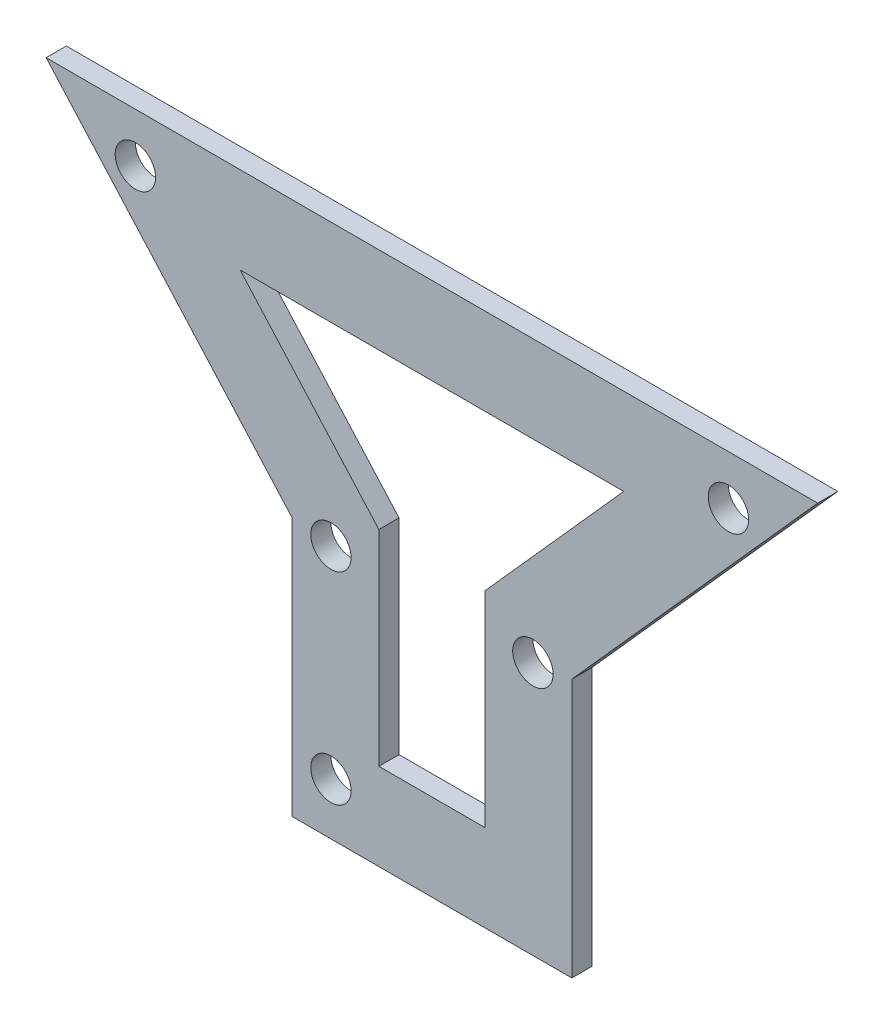
ISO-10303-21;
HEADER;
FILE_DESCRIPTION(('STEP AP214'),'2;1');
FILE_NAME('part.step','',(''),(''),'','','');
FILE_SCHEMA(('AUTOMOTIVE_DESIGN { 1 0 10303 214 1 1 1 1 }'));
ENDSEC;
DATA;
#1=APPLICATION_CONTEXT('core data for automotive mechanical design processes');
#2=APPLICATION_PROTOCOL_DEFINITION('international standard','automotive_design',2000,#1);
#3=PRODUCT_CONTEXT('',#1,'mechanical');
#4=PRODUCT('Part','Part','',(#3));
#5=PRODUCT_RELATED_PRODUCT_CATEGORY('part','',(#4));
#6=PRODUCT_DEFINITION_FORMATION('','',#4);
#7=PRODUCT_DEFINITION_CONTEXT('part definition',#1,'design');
#8=PRODUCT_DEFINITION('design','',#6,#7);
#9=PRODUCT_DEFINITION_SHAPE('','',#8);
#10=(LENGTH_UNIT() NAMED_UNIT(*) SI_UNIT(.MILLI.,.METRE.));
#11=(NAMED_UNIT(*) PLANE_ANGLE_UNIT() SI_UNIT($,.RADIAN.));
#12=(NAMED_UNIT(*) SI_UNIT($,.STERADIAN.) SOLID_ANGLE_UNIT());
#13=UNCERTAINTY_MEASURE_WITH_UNIT(LENGTH_MEASURE(1.E-05),#10,'distance_accuracy_value','');
#14=(GEOMETRIC_REPRESENTATION_CONTEXT(3) GLOBAL_UNCERTAINTY_ASSIGNED_CONTEXT((#13)) GLOBAL_UNIT_ASSIGNED_CONTEXT((#10,
#11,#12)) REPRESENTATION_CONTEXT('',''));
#15=CARTESIAN_POINT('',(0.,0.,0.));
#16=DIRECTION('',(0.,0.,1.));
#17=DIRECTION('',(1.,0.,0.));
#18=AXIS2_PLACEMENT_3D('',#15,#16,#17);
#19=CARTESIAN_POINT('',(0.,0.,10.));
#20=DIRECTION('',(0.,0.,-1.));
#21=DIRECTION('',(-1.,0.,0.));
#22=AXIS2_PLACEMENT_3D('',#19,#20,#21);
#23=PLANE('',#22);
#24=CARTESIAN_POINT('',(-146.807623038619,114.578724559198,10.));
#25=DIRECTION('',(0.,0.,1.));
#26=DIRECTION('',(1.,0.,0.));
#27=AXIS2_PLACEMENT_3D('',#24,#25,#26);
#28=CIRCLE('',#27,9.99999999999998);
#29=CARTESIAN_POINT('',(-136.807623038619,114.578724559198,10.));
#30=VERTEX_POINT('',#29);
#31=EDGE_CURVE('E501',#30,#30,#28,.T.);
#32=ORIENTED_EDGE('',*,*,#31,.F.);
#33=EDGE_LOOP('',(#32));
#34=FACE_BOUND('',#33,.T.);
#35=CARTESIAN_POINT('',(50.,0.,10.));
#36=DIRECTION('',(0.,0.,1.));
#37=DIRECTION('',(1.,0.,0.));
#38=AXIS2_PLACEMENT_3D('',#35,#36,#37);
#39=CIRCLE('',#38,9.99999999999999);
#40=CARTESIAN_POINT('',(60.,0.,10.));
#41=VERTEX_POINT('',#40);
#42=EDGE_CURVE('E525',#41,#41,#39,.T.);
#43=ORIENTED_EDGE('',*,*,#42,.F.);
#44=EDGE_LOOP('',(#43));
#45=FACE_BOUND('',#44,.T.);
#46=CARTESIAN_POINT('',(-50.,-100.,10.));
#47=DIRECTION('',(0.,0.,1.));
#48=DIRECTION('',(1.,0.,0.));
#49=AXIS2_PLACEMENT_3D('',#46,#47,#48);
#50=CIRCLE('',#49,10.);
#51=CARTESIAN_POINT('',(-40.,-100.,10.));
#52=VERTEX_POINT('',#51);
#53=EDGE_CURVE('E517',#52,#52,#50,.T.);
#54=ORIENTED_EDGE('',*,*,#53,.F.);
#55=EDGE_LOOP('',(#54));
#56=FACE_BOUND('',#55,.T.);
#57=CARTESIAN_POINT('',(-50.,0.,10.));
#58=DIRECTION('',(0.,0.,1.));
#59=DIRECTION('',(1.,0.,0.));
#60=AXIS2_PLACEMENT_3D('',#57,#58,#59);
#61=CIRCLE('',#60,10.);
#62=CARTESIAN_POINT('',(-40.,0.,10.));
#63=VERTEX_POINT('',#62);
#64=EDGE_CURVE('E516',#63,#63,#61,.T.);
#65=ORIENTED_EDGE('',*,*,#64,.F.);
#66=EDGE_LOOP('',(#65));
#67=FACE_BOUND('',#66,.T.);
#68=CARTESIAN_POINT('',(146.807623038619,114.578724559198,10.));
#69=DIRECTION('',(0.,0.,1.));
#70=DIRECTION('',(1.,0.,0.));
#71=AXIS2_PLACEMENT_3D('',#68,#69,#70);
#72=CIRCLE('',#71,10.);
#73=CARTESIAN_POINT('',(156.807623038619,114.578724559198,10.));
#74=VERTEX_POINT('',#73);
#75=EDGE_CURVE('E509',#74,#74,#72,.T.);
#76=ORIENTED_EDGE('',*,*,#75,.F.);
#77=EDGE_LOOP('',(#76));
#78=FACE_BOUND('',#77,.T.);
#79=DIRECTION('',(0.,-1.,0.));
#80=VECTOR('',#79,1.);
#81=CARTESIAN_POINT('',(69.2702640138782,2.53280531523941,10.));
#82=LINE('',#81,#80);
#83=CARTESIAN_POINT('',(69.2702640138782,2.53280531523941,10.));
#84=VERTEX_POINT('',#83);
#85=CARTESIAN_POINT('',(69.2702640138782,-125.601784109811,10.));
#86=VERTEX_POINT('',#85);
#87=EDGE_CURVE('E237',#84,#86,#82,.T.);
#88=ORIENTED_EDGE('',*,*,#87,.F.);
#89=DIRECTION('',(0.665963027274692,0.745984749377042,0.));
#90=VECTOR('',#89,1.);
#91=CARTESIAN_POINT('',(69.2702640138782,2.53280531523941,10.));
#92=LINE('',#91,#90);
#93=CARTESIAN_POINT('',(190.995381487231,138.884340659251,10.));
#94=VERTEX_POINT('',#93);
#95=EDGE_CURVE('E256',#84,#94,#92,.T.);
#96=ORIENTED_EDGE('',*,*,#95,.T.);
#97=DIRECTION('',(-1.,0.,0.));
#98=VECTOR('',#97,1.);
#99=CARTESIAN_POINT('',(190.995381487231,138.884340659251,10.));
#100=LINE('',#99,#98);
#101=CARTESIAN_POINT('',(-190.995381487231,138.884340659251,10.));
#102=VERTEX_POINT('',#101);
#103=EDGE_CURVE('E253',#94,#102,#100,.T.);
#104=ORIENTED_EDGE('',*,*,#103,.T.);
#105=DIRECTION('',(-0.665963027274693,0.745984749377041,0.));
#106=VECTOR('',#105,1.);
#107=CARTESIAN_POINT('',(-69.2702640138782,2.5328053152393,10.));
#108=LINE('',#107,#106);
#109=CARTESIAN_POINT('',(-69.2702640138782,2.5328053152393,10.));
#110=VERTEX_POINT('',#109);
#111=EDGE_CURVE('E249',#110,#102,#108,.T.);
#112=ORIENTED_EDGE('',*,*,#111,.F.);
#113=DIRECTION('',(0.,-1.,0.));
#114=VECTOR('',#113,1.);
#115=CARTESIAN_POINT('',(-69.2702640138782,2.5328053152393,10.));
#116=LINE('',#115,#114);
#117=CARTESIAN_POINT('',(-69.2702640138782,-125.601784109811,10.));
#118=VERTEX_POINT('',#117);
#119=EDGE_CURVE('E246',#110,#118,#116,.T.);
#120=ORIENTED_EDGE('',*,*,#119,.T.);
#121=DIRECTION('',(-1.,0.,0.));
#122=VECTOR('',#121,1.);
#123=CARTESIAN_POINT('',(69.2702640138782,-125.601784109811,10.));
#124=LINE('',#123,#122);
#125=EDGE_CURVE('E241',#86,#118,#124,.T.);
#126=ORIENTED_EDGE('',*,*,#125,.F.);
#127=EDGE_LOOP('',(#88,#96,#104,#112,#120,#126));
#128=FACE_BOUND('',#127,.T.);
#129=DIRECTION('',(0.665963027274692,0.745984749377041,0.));
#130=VECTOR('',#129,1.);
#131=CARTESIAN_POINT('',(26.2702640138782,18.9340998758185,10.));
#132=LINE('',#131,#130);
#133=CARTESIAN_POINT('',(26.2702640138782,18.9340998758185,10.));
#134=VERTEX_POINT('',#133);
#135=CARTESIAN_POINT('',(94.9660588601479,95.8843406592509,10.));
#136=VERTEX_POINT('',#135);
#137=EDGE_CURVE('E165',#134,#136,#132,.T.);
#138=ORIENTED_EDGE('',*,*,#137,.F.);
#139=DIRECTION('',(0.,1.,0.));
#140=VECTOR('',#139,1.);
#141=CARTESIAN_POINT('',(26.2702640138782,-82.6017841098114,10.));
#142=LINE('',#141,#140);
#143=CARTESIAN_POINT('',(26.2702640138782,-82.6017841098114,10.));
#144=VERTEX_POINT('',#143);
#145=EDGE_CURVE('E202',#144,#134,#142,.T.);
#146=ORIENTED_EDGE('',*,*,#145,.F.);
#147=DIRECTION('',(1.,0.,0.));
#148=VECTOR('',#147,1.);
#149=CARTESIAN_POINT('',(-26.2702640138782,-82.6017841098114,10.));
#150=LINE('',#149,#148);
#151=CARTESIAN_POINT('',(-26.2702640138782,-82.6017841098114,10.));
#152=VERTEX_POINT('',#151);
#153=EDGE_CURVE('E199',#152,#144,#150,.T.);
#154=ORIENTED_EDGE('',*,*,#153,.F.);
#155=DIRECTION('',(0.,1.,0.));
#156=VECTOR('',#155,1.);
#157=CARTESIAN_POINT('',(-26.2702640138782,-82.6017841098114,10.));
#158=LINE('',#157,#156);
#159=CARTESIAN_POINT('',(-26.2702640138782,18.9340998758184,10.));
#160=VERTEX_POINT('',#159);
#161=EDGE_CURVE('E193',#152,#160,#158,.T.);
#162=ORIENTED_EDGE('',*,*,#161,.T.);
#163=DIRECTION('',(-0.665963027274692,0.745984749377041,0.));
#164=VECTOR('',#163,1.);
#165=CARTESIAN_POINT('',(-26.2702640138782,18.9340998758184,10.));
#166=LINE('',#165,#164);
#167=CARTESIAN_POINT('',(-94.9660588601479,95.8843406592508,10.));
#168=VERTEX_POINT('',#167);
#169=EDGE_CURVE('E189',#160,#168,#166,.T.);
#170=ORIENTED_EDGE('',*,*,#169,.T.);
#171=DIRECTION('',(-1.,0.,0.));
#172=VECTOR('',#171,1.);
#173=CARTESIAN_POINT('',(94.9660588601479,95.8843406592509,10.));
#174=LINE('',#173,#172);
#175=EDGE_CURVE('E174',#136,#168,#174,.T.);
#176=ORIENTED_EDGE('',*,*,#175,.F.);
#177=EDGE_LOOP('',(#138,#146,#154,#162,#170,#176));
#178=FACE_BOUND('',#177,.T.);
#179=ADVANCED_FACE('F74',(#34,#45,#56,#67,#78,#128,#178),#23,.F.);
#180=CARTESIAN_POINT('',(0.,0.,0.));
#181=DIRECTION('',(0.,0.,-1.));
#182=DIRECTION('',(-1.,0.,0.));
#183=AXIS2_PLACEMENT_3D('',#180,#181,#182);
#184=PLANE('',#183);
#185=CARTESIAN_POINT('',(-146.807623038619,114.578724559198,0.));
#186=DIRECTION('',(0.,0.,1.));
#187=DIRECTION('',(1.,0.,0.));
#188=AXIS2_PLACEMENT_3D('',#185,#186,#187);
#189=CIRCLE('',#188,9.99999999999998);
#190=CARTESIAN_POINT('',(-136.807623038619,114.578724559198,0.));
#191=VERTEX_POINT('',#190);
#192=EDGE_CURVE('E207',#191,#191,#189,.T.);
#193=ORIENTED_EDGE('',*,*,#192,.T.);
#194=EDGE_LOOP('',(#193));
#195=FACE_BOUND('',#194,.T.);
#196=CARTESIAN_POINT('',(50.,0.,0.));
#197=DIRECTION('',(0.,0.,1.));
#198=DIRECTION('',(1.,0.,0.));
#199=AXIS2_PLACEMENT_3D('',#196,#197,#198);
#200=CIRCLE('',#199,9.99999999999999);
#201=CARTESIAN_POINT('',(60.,0.,0.));
#202=VERTEX_POINT('',#201);
#203=EDGE_CURVE('E521',#202,#202,#200,.T.);
#204=ORIENTED_EDGE('',*,*,#203,.T.);
#205=EDGE_LOOP('',(#204));
#206=FACE_BOUND('',#205,.T.);
#207=CARTESIAN_POINT('',(-50.,-100.,0.));
#208=DIRECTION('',(0.,0.,1.));
#209=DIRECTION('',(1.,0.,0.));
#210=AXIS2_PLACEMENT_3D('',#207,#208,#209);
#211=CIRCLE('',#210,10.);
#212=CARTESIAN_POINT('',(-40.,-100.,0.));
#213=VERTEX_POINT('',#212);
#214=EDGE_CURVE('E512',#213,#213,#211,.T.);
#215=ORIENTED_EDGE('',*,*,#214,.T.);
#216=EDGE_LOOP('',(#215));
#217=FACE_BOUND('',#216,.T.);
#218=CARTESIAN_POINT('',(-50.,0.,0.));
#219=DIRECTION('',(0.,0.,1.));
#220=DIRECTION('',(1.,0.,0.));
#221=AXIS2_PLACEMENT_3D('',#218,#219,#220);
#222=CIRCLE('',#221,10.);
#223=CARTESIAN_POINT('',(-40.,0.,0.));
#224=VERTEX_POINT('',#223);
#225=EDGE_CURVE('E532',#224,#224,#222,.T.);
#226=ORIENTED_EDGE('',*,*,#225,.T.);
#227=EDGE_LOOP('',(#226));
#228=FACE_BOUND('',#227,.T.);
#229=CARTESIAN_POINT('',(146.807623038619,114.578724559198,0.));
#230=DIRECTION('',(0.,0.,1.));
#231=DIRECTION('',(1.,0.,0.));
#232=AXIS2_PLACEMENT_3D('',#229,#230,#231);
#233=CIRCLE('',#232,10.);
#234=CARTESIAN_POINT('',(156.807623038619,114.578724559198,0.));
#235=VERTEX_POINT('',#234);
#236=EDGE_CURVE('E503',#235,#235,#233,.T.);
#237=ORIENTED_EDGE('',*,*,#236,.T.);
#238=EDGE_LOOP('',(#237));
#239=FACE_BOUND('',#238,.T.);
#240=DIRECTION('',(0.,-1.,0.));
#241=VECTOR('',#240,1.);
#242=CARTESIAN_POINT('',(69.2702640138782,2.53280531523941,0.));
#243=LINE('',#242,#241);
#244=CARTESIAN_POINT('',(69.2702640138782,2.53280531523941,0.));
#245=VERTEX_POINT('',#244);
#246=CARTESIAN_POINT('',(69.2702640138782,-125.601784109811,0.));
#247=VERTEX_POINT('',#246);
#248=EDGE_CURVE('E183',#245,#247,#243,.T.);
#249=ORIENTED_EDGE('',*,*,#248,.T.);
#250=DIRECTION('',(-1.,0.,0.));
#251=VECTOR('',#250,1.);
#252=CARTESIAN_POINT('',(69.2702640138782,-125.601784109811,0.));
#253=LINE('',#252,#251);
#254=CARTESIAN_POINT('',(-69.2702640138782,-125.601784109811,0.));
#255=VERTEX_POINT('',#254);
#256=EDGE_CURVE('E262',#247,#255,#253,.T.);
#257=ORIENTED_EDGE('',*,*,#256,.T.);
#258=DIRECTION('',(0.,-1.,0.));
#259=VECTOR('',#258,1.);
#260=CARTESIAN_POINT('',(-69.2702640138782,2.5328053152393,0.));
#261=LINE('',#260,#259);
#262=CARTESIAN_POINT('',(-69.2702640138782,2.5328053152393,0.));
#263=VERTEX_POINT('',#262);
#264=EDGE_CURVE('E266',#263,#255,#261,.T.);
#265=ORIENTED_EDGE('',*,*,#264,.F.);
#266=DIRECTION('',(-0.665963027274693,0.745984749377041,0.));
#267=VECTOR('',#266,1.);
#268=CARTESIAN_POINT('',(-69.2702640138782,2.5328053152393,0.));
#269=LINE('',#268,#267);
#270=CARTESIAN_POINT('',(-190.995381487231,138.884340659251,0.));
#271=VERTEX_POINT('',#270);
#272=EDGE_CURVE('E270',#263,#271,#269,.T.);
#273=ORIENTED_EDGE('',*,*,#272,.T.);
#274=DIRECTION('',(-1.,0.,0.));
#275=VECTOR('',#274,1.);
#276=CARTESIAN_POINT('',(190.995381487231,138.884340659251,0.));
#277=LINE('',#276,#275);
#278=CARTESIAN_POINT('',(190.995381487231,138.884340659251,0.));
#279=VERTEX_POINT('',#278);
#280=EDGE_CURVE('E274',#279,#271,#277,.T.);
#281=ORIENTED_EDGE('',*,*,#280,.F.);
#282=DIRECTION('',(0.665963027274692,0.745984749377042,0.));
#283=VECTOR('',#282,1.);
#284=CARTESIAN_POINT('',(69.2702640138782,2.53280531523941,0.));
#285=LINE('',#284,#283);
#286=EDGE_CURVE('E242',#245,#279,#285,.T.);
#287=ORIENTED_EDGE('',*,*,#286,.F.);
#288=EDGE_LOOP('',(#249,#257,#265,#273,#281,#287));
#289=FACE_BOUND('',#288,.T.);
#290=DIRECTION('',(0.,1.,0.));
#291=VECTOR('',#290,1.);
#292=CARTESIAN_POINT('',(26.2702640138782,-82.6017841098114,0.));
#293=LINE('',#292,#291);
#294=CARTESIAN_POINT('',(26.2702640138782,-82.6017841098114,0.));
#295=VERTEX_POINT('',#294);
#296=CARTESIAN_POINT('',(26.2702640138782,18.9340998758185,0.));
#297=VERTEX_POINT('',#296);
#298=EDGE_CURVE('E175',#295,#297,#293,.T.);
#299=ORIENTED_EDGE('',*,*,#298,.T.);
#300=DIRECTION('',(0.665963027274692,0.745984749377041,0.));
#301=VECTOR('',#300,1.);
#302=CARTESIAN_POINT('',(26.2702640138782,18.9340998758185,0.));
#303=LINE('',#302,#301);
#304=CARTESIAN_POINT('',(94.9660588601479,95.8843406592509,0.));
#305=VERTEX_POINT('',#304);
#306=EDGE_CURVE('E100',#297,#305,#303,.T.);
#307=ORIENTED_EDGE('',*,*,#306,.T.);
#308=DIRECTION('',(-1.,0.,0.));
#309=VECTOR('',#308,1.);
#310=CARTESIAN_POINT('',(94.9660588601479,95.8843406592509,0.));
#311=LINE('',#310,#309);
#312=CARTESIAN_POINT('',(-94.9660588601479,95.8843406592508,0.));
#313=VERTEX_POINT('',#312);
#314=EDGE_CURVE('E181',#305,#313,#311,.T.);
#315=ORIENTED_EDGE('',*,*,#314,.T.);
#316=DIRECTION('',(-0.665963027274692,0.745984749377041,0.));
#317=VECTOR('',#316,1.);
#318=CARTESIAN_POINT('',(-26.2702640138782,18.9340998758184,0.));
#319=LINE('',#318,#317);
#320=CARTESIAN_POINT('',(-26.2702640138782,18.9340998758184,0.));
#321=VERTEX_POINT('',#320);
#322=EDGE_CURVE('E210',#321,#313,#319,.T.);
#323=ORIENTED_EDGE('',*,*,#322,.F.);
#324=DIRECTION('',(0.,1.,0.));
#325=VECTOR('',#324,1.);
#326=CARTESIAN_POINT('',(-26.2702640138782,-82.6017841098114,0.));
#327=LINE('',#326,#325);
#328=CARTESIAN_POINT('',(-26.2702640138782,-82.6017841098114,0.));
#329=VERTEX_POINT('',#328);
#330=EDGE_CURVE('E214',#329,#321,#327,.T.);
#331=ORIENTED_EDGE('',*,*,#330,.F.);
#332=DIRECTION('',(1.,0.,0.));
#333=VECTOR('',#332,1.);
#334=CARTESIAN_POINT('',(-26.2702640138782,-82.6017841098114,0.));
#335=LINE('',#334,#333);
#336=EDGE_CURVE('E218',#329,#295,#335,.T.);
#337=ORIENTED_EDGE('',*,*,#336,.T.);
#338=EDGE_LOOP('',(#299,#307,#315,#323,#331,#337));
#339=FACE_BOUND('',#338,.T.);
#340=ADVANCED_FACE('F302',(#195,#206,#217,#228,#239,#289,#339),#184,.T.);
#341=CARTESIAN_POINT('',(69.2702640138782,2.53280531523941,10.));
#342=DIRECTION('',(1.,0.,0.));
#343=DIRECTION('',(0.,1.,0.));
#344=AXIS2_PLACEMENT_3D('',#341,#342,#343);
#345=PLANE('',#344);
#346=ORIENTED_EDGE('',*,*,#248,.F.);
#347=DIRECTION('',(0.,0.,-1.));
#348=VECTOR('',#347,1.);
#349=CARTESIAN_POINT('',(69.2702640138782,2.53280531523941,10.));
#350=LINE('',#349,#348);
#351=EDGE_CURVE('E12',#84,#245,#350,.T.);
#352=ORIENTED_EDGE('',*,*,#351,.F.);
#353=ORIENTED_EDGE('',*,*,#87,.T.);
#354=DIRECTION('',(0.,0.,-1.));
#355=VECTOR('',#354,1.);
#356=CARTESIAN_POINT('',(69.2702640138782,-125.601784109811,10.));
#357=LINE('',#356,#355);
#358=EDGE_CURVE('E78',#86,#247,#357,.T.);
#359=ORIENTED_EDGE('',*,*,#358,.T.);
#360=EDGE_LOOP('',(#346,#352,#353,#359));
#361=FACE_BOUND('',#360,.T.);
#362=ADVANCED_FACE('F76',(#361),#345,.T.);
#363=CARTESIAN_POINT('',(69.2702640138782,2.53280531523941,10.));
#364=DIRECTION('',(-0.745984749377042,0.665963027274692,0.));
#365=DIRECTION('',(-0.665963027274692,-0.745984749377042,0.));
#366=AXIS2_PLACEMENT_3D('',#363,#364,#365);
#367=PLANE('',#366);
#368=ORIENTED_EDGE('',*,*,#286,.T.);
#369=DIRECTION('',(0.,0.,-1.));
#370=VECTOR('',#369,1.);
#371=CARTESIAN_POINT('',(190.995381487231,138.884340659251,10.));
#372=LINE('',#371,#370);
#373=EDGE_CURVE('E84',#94,#279,#372,.T.);
#374=ORIENTED_EDGE('',*,*,#373,.F.);
#375=ORIENTED_EDGE('',*,*,#95,.F.);
#376=ORIENTED_EDGE('',*,*,#351,.T.);
#377=EDGE_LOOP('',(#368,#374,#375,#376));
#378=FACE_BOUND('',#377,.T.);
#379=ADVANCED_FACE('F307',(#378),#367,.F.);
#380=CARTESIAN_POINT('',(190.995381487231,138.884340659251,10.));
#381=DIRECTION('',(0.,-1.,0.));
#382=DIRECTION('',(1.,0.,0.));
#383=AXIS2_PLACEMENT_3D('',#380,#381,#382);
#384=PLANE('',#383);
#385=ORIENTED_EDGE('',*,*,#280,.T.);
#386=DIRECTION('',(0.,0.,-1.));
#387=VECTOR('',#386,1.);
#388=CARTESIAN_POINT('',(-190.995381487231,138.884340659251,10.));
#389=LINE('',#388,#387);
#390=EDGE_CURVE('E283',#102,#271,#389,.T.);
#391=ORIENTED_EDGE('',*,*,#390,.F.);
#392=ORIENTED_EDGE('',*,*,#103,.F.);
#393=ORIENTED_EDGE('',*,*,#373,.T.);
#394=EDGE_LOOP('',(#385,#391,#392,#393));
#395=FACE_BOUND('',#394,.T.);
#396=ADVANCED_FACE('F311',(#395),#384,.F.);
#397=CARTESIAN_POINT('',(-69.2702640138782,2.5328053152393,10.));
#398=DIRECTION('',(-0.745984749377041,-0.665963027274693,0.));
#399=DIRECTION('',(0.665963027274693,-0.745984749377041,0.));
#400=AXIS2_PLACEMENT_3D('',#397,#398,#399);
#401=PLANE('',#400);
#402=ORIENTED_EDGE('',*,*,#272,.F.);
#403=DIRECTION('',(0.,0.,-1.));
#404=VECTOR('',#403,1.);
#405=CARTESIAN_POINT('',(-69.2702640138782,2.5328053152393,10.));
#406=LINE('',#405,#404);
#407=EDGE_CURVE('E286',#110,#263,#406,.T.);
#408=ORIENTED_EDGE('',*,*,#407,.F.);
#409=ORIENTED_EDGE('',*,*,#111,.T.);
#410=ORIENTED_EDGE('',*,*,#390,.T.);
#411=EDGE_LOOP('',(#402,#408,#409,#410));
#412=FACE_BOUND('',#411,.T.);
#413=ADVANCED_FACE('F320',(#412),#401,.T.);
#414=CARTESIAN_POINT('',(-69.2702640138782,2.5328053152393,10.));
#415=DIRECTION('',(1.,0.,0.));
#416=DIRECTION('',(0.,1.,0.));
#417=AXIS2_PLACEMENT_3D('',#414,#415,#416);
#418=PLANE('',#417);
#419=ORIENTED_EDGE('',*,*,#264,.T.);
#420=DIRECTION('',(0.,0.,-1.));
#421=VECTOR('',#420,1.);
#422=CARTESIAN_POINT('',(-69.2702640138782,-125.601784109811,10.));
#423=LINE('',#422,#421);
#424=EDGE_CURVE('E288',#118,#255,#423,.T.);
#425=ORIENTED_EDGE('',*,*,#424,.F.);
#426=ORIENTED_EDGE('',*,*,#119,.F.);
#427=ORIENTED_EDGE('',*,*,#407,.T.);
#428=EDGE_LOOP('',(#419,#425,#426,#427));
#429=FACE_BOUND('',#428,.T.);
#430=ADVANCED_FACE('F317',(#429),#418,.F.);
#431=CARTESIAN_POINT('',(69.2702640138782,-125.601784109811,10.));
#432=DIRECTION('',(0.,-1.,0.));
#433=DIRECTION('',(0.,0.,-1.));
#434=AXIS2_PLACEMENT_3D('',#431,#432,#433);
#435=PLANE('',#434);
#436=ORIENTED_EDGE('',*,*,#256,.F.);
#437=ORIENTED_EDGE('',*,*,#358,.F.);
#438=ORIENTED_EDGE('',*,*,#125,.T.);
#439=ORIENTED_EDGE('',*,*,#424,.T.);
#440=EDGE_LOOP('',(#436,#437,#438,#439));
#441=FACE_BOUND('',#440,.T.);
#442=ADVANCED_FACE('F298',(#441),#435,.T.);
#443=CARTESIAN_POINT('',(26.2702640138782,18.9340998758185,10.));
#444=DIRECTION('',(-0.745984749377041,0.665963027274692,0.));
#445=DIRECTION('',(-0.665963027274692,-0.745984749377042,0.));
#446=AXIS2_PLACEMENT_3D('',#443,#444,#445);
#447=PLANE('',#446);
#448=ORIENTED_EDGE('',*,*,#306,.F.);
#449=DIRECTION('',(0.,0.,-1.));
#450=VECTOR('',#449,1.);
#451=CARTESIAN_POINT('',(26.2702640138782,18.9340998758185,10.));
#452=LINE('',#451,#450);
#453=EDGE_CURVE('E169',#134,#297,#452,.T.);
#454=ORIENTED_EDGE('',*,*,#453,.F.);
#455=ORIENTED_EDGE('',*,*,#137,.T.);
#456=DIRECTION('',(0.,0.,-1.));
#457=VECTOR('',#456,1.);
#458=CARTESIAN_POINT('',(94.9660588601479,95.8843406592509,10.));
#459=LINE('',#458,#457);
#460=EDGE_CURVE('E168',#136,#305,#459,.T.);
#461=ORIENTED_EDGE('',*,*,#460,.T.);
#462=EDGE_LOOP('',(#448,#454,#455,#461));
#463=FACE_BOUND('',#462,.T.);
#464=ADVANCED_FACE('F167',(#463),#447,.T.);
#465=CARTESIAN_POINT('',(94.9660588601479,95.8843406592509,10.));
#466=DIRECTION('',(0.,-1.,0.));
#467=DIRECTION('',(1.,0.,0.));
#468=AXIS2_PLACEMENT_3D('',#465,#466,#467);
#469=PLANE('',#468);
#470=ORIENTED_EDGE('',*,*,#314,.F.);
#471=ORIENTED_EDGE('',*,*,#460,.F.);
#472=ORIENTED_EDGE('',*,*,#175,.T.);
#473=DIRECTION('',(0.,0.,-1.));
#474=VECTOR('',#473,1.);
#475=CARTESIAN_POINT('',(-94.9660588601479,95.8843406592508,10.));
#476=LINE('',#475,#474);
#477=EDGE_CURVE('E184',#168,#313,#476,.T.);
#478=ORIENTED_EDGE('',*,*,#477,.T.);
#479=EDGE_LOOP('',(#470,#471,#472,#478));
#480=FACE_BOUND('',#479,.T.);
#481=ADVANCED_FACE('F178',(#480),#469,.T.);
#482=CARTESIAN_POINT('',(-26.2702640138782,18.9340998758184,10.));
#483=DIRECTION('',(-0.745984749377041,-0.665963027274692,0.));
#484=DIRECTION('',(0.665963027274692,-0.745984749377042,0.));
#485=AXIS2_PLACEMENT_3D('',#482,#483,#484);
#486=PLANE('',#485);
#487=ORIENTED_EDGE('',*,*,#322,.T.);
#488=ORIENTED_EDGE('',*,*,#477,.F.);
#489=ORIENTED_EDGE('',*,*,#169,.F.);
#490=DIRECTION('',(0.,0.,-1.));
#491=VECTOR('',#490,1.);
#492=CARTESIAN_POINT('',(-26.2702640138782,18.9340998758184,10.));
#493=LINE('',#492,#491);
#494=EDGE_CURVE('E232',#160,#321,#493,.T.);
#495=ORIENTED_EDGE('',*,*,#494,.T.);
#496=EDGE_LOOP('',(#487,#488,#489,#495));
#497=FACE_BOUND('',#496,.T.);
#498=ADVANCED_FACE('F425',(#497),#486,.F.);
#499=CARTESIAN_POINT('',(-26.2702640138782,-82.6017841098114,10.));
#500=DIRECTION('',(-1.,0.,0.));
#501=DIRECTION('',(0.,0.,1.));
#502=AXIS2_PLACEMENT_3D('',#499,#500,#501);
#503=PLANE('',#502);
#504=ORIENTED_EDGE('',*,*,#330,.T.);
#505=ORIENTED_EDGE('',*,*,#494,.F.);
#506=ORIENTED_EDGE('',*,*,#161,.F.);
#507=DIRECTION('',(0.,0.,-1.));
#508=VECTOR('',#507,1.);
#509=CARTESIAN_POINT('',(-26.2702640138782,-82.6017841098114,10.));
#510=LINE('',#509,#508);
#511=EDGE_CURVE('E229',#152,#329,#510,.T.);
#512=ORIENTED_EDGE('',*,*,#511,.T.);
#513=EDGE_LOOP('',(#504,#505,#506,#512));
#514=FACE_BOUND('',#513,.T.);
#515=ADVANCED_FACE('F421',(#514),#503,.F.);
#516=CARTESIAN_POINT('',(-26.2702640138782,-82.6017841098114,10.));
#517=DIRECTION('',(0.,1.,0.));
#518=DIRECTION('',(-1.,0.,0.));
#519=AXIS2_PLACEMENT_3D('',#516,#517,#518);
#520=PLANE('',#519);
#521=ORIENTED_EDGE('',*,*,#336,.F.);
#522=ORIENTED_EDGE('',*,*,#511,.F.);
#523=ORIENTED_EDGE('',*,*,#153,.T.);
#524=DIRECTION('',(0.,0.,-1.));
#525=VECTOR('',#524,1.);
#526=CARTESIAN_POINT('',(26.2702640138782,-82.6017841098114,10.));
#527=LINE('',#526,#525);
#528=EDGE_CURVE('E92',#144,#295,#527,.T.);
#529=ORIENTED_EDGE('',*,*,#528,.T.);
#530=EDGE_LOOP('',(#521,#522,#523,#529));
#531=FACE_BOUND('',#530,.T.);
#532=ADVANCED_FACE('F418',(#531),#520,.T.);
#533=CARTESIAN_POINT('',(26.2702640138782,-82.6017841098114,10.));
#534=DIRECTION('',(-1.,0.,0.));
#535=DIRECTION('',(0.,0.,1.));
#536=AXIS2_PLACEMENT_3D('',#533,#534,#535);
#537=PLANE('',#536);
#538=ORIENTED_EDGE('',*,*,#298,.F.);
#539=ORIENTED_EDGE('',*,*,#528,.F.);
#540=ORIENTED_EDGE('',*,*,#145,.T.);
#541=ORIENTED_EDGE('',*,*,#453,.T.);
#542=EDGE_LOOP('',(#538,#539,#540,#541));
#543=FACE_BOUND('',#542,.T.);
#544=ADVANCED_FACE('F368',(#543),#537,.T.);
#545=CARTESIAN_POINT('',(146.807623038619,114.578724559198,0.));
#546=DIRECTION('',(0.,0.,1.));
#547=DIRECTION('',(1.,0.,0.));
#548=AXIS2_PLACEMENT_3D('',#545,#546,#547);
#549=CYLINDRICAL_SURFACE('',#548,10.);
#550=ORIENTED_EDGE('',*,*,#236,.F.);
#551=EDGE_LOOP('',(#550));
#552=FACE_BOUND('',#551,.T.);
#553=ORIENTED_EDGE('',*,*,#75,.T.);
#554=EDGE_LOOP('',(#553));
#555=FACE_BOUND('',#554,.T.);
#556=ADVANCED_FACE('F362',(#552,#555),#549,.F.);
#557=CARTESIAN_POINT('',(-50.,0.,0.));
#558=DIRECTION('',(0.,0.,1.));
#559=DIRECTION('',(1.,0.,0.));
#560=AXIS2_PLACEMENT_3D('',#557,#558,#559);
#561=CYLINDRICAL_SURFACE('',#560,10.);
#562=ORIENTED_EDGE('',*,*,#225,.F.);
#563=EDGE_LOOP('',(#562));
#564=FACE_BOUND('',#563,.T.);
#565=ORIENTED_EDGE('',*,*,#64,.T.);
#566=EDGE_LOOP('',(#565));
#567=FACE_BOUND('',#566,.T.);
#568=ADVANCED_FACE('F367',(#564,#567),#561,.F.);
#569=CARTESIAN_POINT('',(-50.,-100.,0.));
#570=DIRECTION('',(0.,0.,1.));
#571=DIRECTION('',(1.,0.,0.));
#572=AXIS2_PLACEMENT_3D('',#569,#570,#571);
#573=CYLINDRICAL_SURFACE('',#572,10.);
#574=ORIENTED_EDGE('',*,*,#214,.F.);
#575=EDGE_LOOP('',(#574));
#576=FACE_BOUND('',#575,.T.);
#577=ORIENTED_EDGE('',*,*,#53,.T.);
#578=EDGE_LOOP('',(#577));
#579=FACE_BOUND('',#578,.T.);
#580=ADVANCED_FACE('F380',(#576,#579),#573,.F.);
#581=CARTESIAN_POINT('',(50.,0.,0.));
#582=DIRECTION('',(0.,0.,1.));
#583=DIRECTION('',(1.,0.,0.));
#584=AXIS2_PLACEMENT_3D('',#581,#582,#583);
#585=CYLINDRICAL_SURFACE('',#584,9.99999999999999);
#586=ORIENTED_EDGE('',*,*,#203,.F.);
#587=EDGE_LOOP('',(#586));
#588=FACE_BOUND('',#587,.T.);
#589=ORIENTED_EDGE('',*,*,#42,.T.);
#590=EDGE_LOOP('',(#589));
#591=FACE_BOUND('',#590,.T.);
#592=ADVANCED_FACE('F390',(#588,#591),#585,.F.);
#593=CARTESIAN_POINT('',(-146.807623038619,114.578724559198,0.));
#594=DIRECTION('',(0.,0.,1.));
#595=DIRECTION('',(1.,0.,0.));
#596=AXIS2_PLACEMENT_3D('',#593,#594,#595);
#597=CYLINDRICAL_SURFACE('',#596,9.99999999999998);
#598=ORIENTED_EDGE('',*,*,#192,.F.);
#599=EDGE_LOOP('',(#598));
#600=FACE_BOUND('',#599,.T.);
#601=ORIENTED_EDGE('',*,*,#31,.T.);
#602=EDGE_LOOP('',(#601));
#603=FACE_BOUND('',#602,.T.);
#604=ADVANCED_FACE('F400',(#600,#603),#597,.F.);
#605=CLOSED_SHELL('',(#179,#340,#362,#379,#396,#413,#430,#442,#464,#481,#498,#515,#532,#544,
#556,#568,#580,#592,#604));
#606=MANIFOLD_SOLID_BREP('B2',#605);
#607=ADVANCED_BREP_SHAPE_REPRESENTATION('',(#18,#606),#14);
#608=SHAPE_DEFINITION_REPRESENTATION(#9,#607);
ENDSEC;
END-ISO-10303-21;
